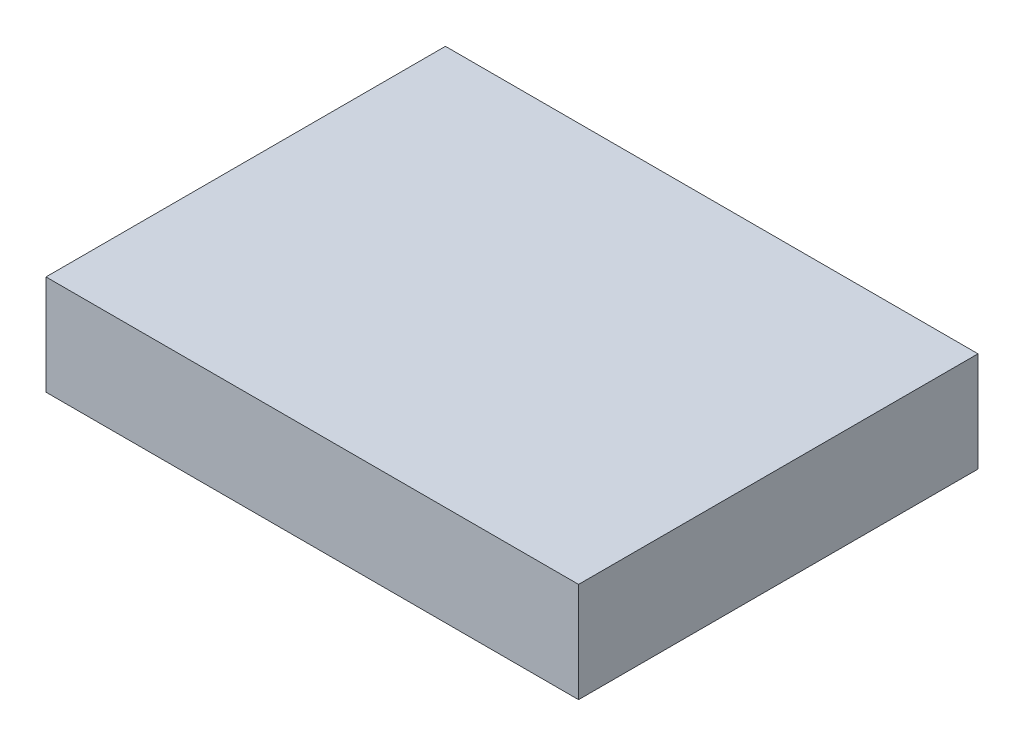
ISO-10303-21;
HEADER;
FILE_DESCRIPTION(('STEP AP214'),'2;1');
FILE_NAME('part.step','',(''),(''),'','','');
FILE_SCHEMA(('AUTOMOTIVE_DESIGN { 1 0 10303 214 1 1 1 1 }'));
ENDSEC;
DATA;
#1=APPLICATION_CONTEXT('core data for automotive mechanical design processes');
#2=APPLICATION_PROTOCOL_DEFINITION('international standard','automotive_design',2000,#1);
#3=PRODUCT_CONTEXT('',#1,'mechanical');
#4=PRODUCT('Part','Part','',(#3));
#5=PRODUCT_RELATED_PRODUCT_CATEGORY('part','',(#4));
#6=PRODUCT_DEFINITION_FORMATION('','',#4);
#7=PRODUCT_DEFINITION_CONTEXT('part definition',#1,'design');
#8=PRODUCT_DEFINITION('design','',#6,#7);
#9=PRODUCT_DEFINITION_SHAPE('','',#8);
#10=(LENGTH_UNIT() NAMED_UNIT(*) SI_UNIT(.MILLI.,.METRE.));
#11=(NAMED_UNIT(*) PLANE_ANGLE_UNIT() SI_UNIT($,.RADIAN.));
#12=(NAMED_UNIT(*) SI_UNIT($,.STERADIAN.) SOLID_ANGLE_UNIT());
#13=UNCERTAINTY_MEASURE_WITH_UNIT(LENGTH_MEASURE(1.E-05),#10,'distance_accuracy_value','');
#14=(GEOMETRIC_REPRESENTATION_CONTEXT(3) GLOBAL_UNCERTAINTY_ASSIGNED_CONTEXT((#13)) GLOBAL_UNIT_ASSIGNED_CONTEXT((#10,
#11,#12)) REPRESENTATION_CONTEXT('',''));
#15=CARTESIAN_POINT('',(0.,0.,0.));
#16=DIRECTION('',(0.,0.,1.));
#17=DIRECTION('',(1.,0.,0.));
#18=AXIS2_PLACEMENT_3D('',#15,#16,#17);
#19=CARTESIAN_POINT('',(0.,-19.05,0.));
#20=DIRECTION('',(-1.,0.,0.));
#21=DIRECTION('',(0.,0.,1.));
#22=AXIS2_PLACEMENT_3D('',#19,#20,#21);
#23=PLANE('',#22);
#24=DIRECTION('',(0.,0.,1.));
#25=VECTOR('',#24,1.);
#26=CARTESIAN_POINT('',(0.,0.,0.));
#27=LINE('',#26,#25);
#28=CARTESIAN_POINT('',(0.,0.,-76.2));
#29=VERTEX_POINT('',#28);
#30=CARTESIAN_POINT('',(0.,0.,0.));
#31=VERTEX_POINT('',#30);
#32=EDGE_CURVE('E95',#29,#31,#27,.T.);
#33=ORIENTED_EDGE('',*,*,#32,.F.);
#34=DIRECTION('',(0.,1.,0.));
#35=VECTOR('',#34,1.);
#36=CARTESIAN_POINT('',(0.,-19.05,-76.2));
#37=LINE('',#36,#35);
#38=CARTESIAN_POINT('',(0.,-19.05,-76.2));
#39=VERTEX_POINT('',#38);
#40=EDGE_CURVE('E11',#39,#29,#37,.T.);
#41=ORIENTED_EDGE('',*,*,#40,.F.);
#42=DIRECTION('',(0.,0.,1.));
#43=VECTOR('',#42,1.);
#44=CARTESIAN_POINT('',(0.,-19.05,0.));
#45=LINE('',#44,#43);
#46=CARTESIAN_POINT('',(0.,-19.05,0.));
#47=VERTEX_POINT('',#46);
#48=EDGE_CURVE('E89',#39,#47,#45,.T.);
#49=ORIENTED_EDGE('',*,*,#48,.T.);
#50=DIRECTION('',(0.,1.,0.));
#51=VECTOR('',#50,1.);
#52=CARTESIAN_POINT('',(0.,-19.05,0.));
#53=LINE('',#52,#51);
#54=EDGE_CURVE('E34',#47,#31,#53,.T.);
#55=ORIENTED_EDGE('',*,*,#54,.T.);
#56=EDGE_LOOP('',(#33,#41,#49,#55));
#57=FACE_BOUND('',#56,.T.);
#58=ADVANCED_FACE('F31',(#57),#23,.T.);
#59=CARTESIAN_POINT('',(0.,-19.05,-76.2));
#60=DIRECTION('',(0.,0.,-1.));
#61=DIRECTION('',(-1.,0.,0.));
#62=AXIS2_PLACEMENT_3D('',#59,#60,#61);
#63=PLANE('',#62);
#64=DIRECTION('',(-1.,0.,0.));
#65=VECTOR('',#64,1.);
#66=CARTESIAN_POINT('',(0.,0.,-76.2));
#67=LINE('',#66,#65);
#68=CARTESIAN_POINT('',(101.6,0.,-76.2));
#69=VERTEX_POINT('',#68);
#70=EDGE_CURVE('E91',#69,#29,#67,.T.);
#71=ORIENTED_EDGE('',*,*,#70,.F.);
#72=DIRECTION('',(0.,1.,0.));
#73=VECTOR('',#72,1.);
#74=CARTESIAN_POINT('',(101.6,-19.05,-76.2));
#75=LINE('',#74,#73);
#76=CARTESIAN_POINT('',(101.6,-19.05,-76.2));
#77=VERTEX_POINT('',#76);
#78=EDGE_CURVE('E40',#77,#69,#75,.T.);
#79=ORIENTED_EDGE('',*,*,#78,.F.);
#80=DIRECTION('',(-1.,0.,0.));
#81=VECTOR('',#80,1.);
#82=CARTESIAN_POINT('',(0.,-19.05,-76.2));
#83=LINE('',#82,#81);
#84=EDGE_CURVE('E86',#77,#39,#83,.T.);
#85=ORIENTED_EDGE('',*,*,#84,.T.);
#86=ORIENTED_EDGE('',*,*,#40,.T.);
#87=EDGE_LOOP('',(#71,#79,#85,#86));
#88=FACE_BOUND('',#87,.T.);
#89=ADVANCED_FACE('F105',(#88),#63,.T.);
#90=CARTESIAN_POINT('',(101.6,-19.05,0.));
#91=DIRECTION('',(1.,0.,0.));
#92=DIRECTION('',(0.,0.,-1.));
#93=AXIS2_PLACEMENT_3D('',#90,#91,#92);
#94=PLANE('',#93);
#95=DIRECTION('',(0.,0.,-1.));
#96=VECTOR('',#95,1.);
#97=CARTESIAN_POINT('',(101.6,0.,0.));
#98=LINE('',#97,#96);
#99=CARTESIAN_POINT('',(101.6,0.,0.));
#100=VERTEX_POINT('',#99);
#101=EDGE_CURVE('E81',#100,#69,#98,.T.);
#102=ORIENTED_EDGE('',*,*,#101,.F.);
#103=DIRECTION('',(0.,1.,0.));
#104=VECTOR('',#103,1.);
#105=CARTESIAN_POINT('',(101.6,-19.05,0.));
#106=LINE('',#105,#104);
#107=CARTESIAN_POINT('',(101.6,-19.05,0.));
#108=VERTEX_POINT('',#107);
#109=EDGE_CURVE('E76',#108,#100,#106,.T.);
#110=ORIENTED_EDGE('',*,*,#109,.F.);
#111=DIRECTION('',(0.,0.,-1.));
#112=VECTOR('',#111,1.);
#113=CARTESIAN_POINT('',(101.6,-19.05,0.));
#114=LINE('',#113,#112);
#115=EDGE_CURVE('E79',#108,#77,#114,.T.);
#116=ORIENTED_EDGE('',*,*,#115,.T.);
#117=ORIENTED_EDGE('',*,*,#78,.T.);
#118=EDGE_LOOP('',(#102,#110,#116,#117));
#119=FACE_BOUND('',#118,.T.);
#120=ADVANCED_FACE('F78',(#119),#94,.T.);
#121=CARTESIAN_POINT('',(0.,-19.05,0.));
#122=DIRECTION('',(0.,0.,1.));
#123=DIRECTION('',(1.,0.,0.));
#124=AXIS2_PLACEMENT_3D('',#121,#122,#123);
#125=PLANE('',#124);
#126=DIRECTION('',(1.,0.,0.));
#127=VECTOR('',#126,1.);
#128=CARTESIAN_POINT('',(0.,0.,0.));
#129=LINE('',#128,#127);
#130=EDGE_CURVE('E98',#31,#100,#129,.T.);
#131=ORIENTED_EDGE('',*,*,#130,.F.);
#132=ORIENTED_EDGE('',*,*,#54,.F.);
#133=DIRECTION('',(1.,0.,0.));
#134=VECTOR('',#133,1.);
#135=CARTESIAN_POINT('',(0.,-19.05,0.));
#136=LINE('',#135,#134);
#137=EDGE_CURVE('E85',#47,#108,#136,.T.);
#138=ORIENTED_EDGE('',*,*,#137,.T.);
#139=ORIENTED_EDGE('',*,*,#109,.T.);
#140=EDGE_LOOP('',(#131,#132,#138,#139));
#141=FACE_BOUND('',#140,.T.);
#142=ADVANCED_FACE('F88',(#141),#125,.T.);
#143=CARTESIAN_POINT('',(0.,-19.05,-76.2));
#144=DIRECTION('',(0.,-1.,0.));
#145=DIRECTION('',(0.,0.,-1.));
#146=AXIS2_PLACEMENT_3D('',#143,#144,#145);
#147=PLANE('',#146);
#148=ORIENTED_EDGE('',*,*,#48,.F.);
#149=ORIENTED_EDGE('',*,*,#84,.F.);
#150=ORIENTED_EDGE('',*,*,#115,.F.);
#151=ORIENTED_EDGE('',*,*,#137,.F.);
#152=EDGE_LOOP('',(#148,#149,#150,#151));
#153=FACE_BOUND('',#152,.T.);
#154=ADVANCED_FACE('F84',(#153),#147,.T.);
#155=CARTESIAN_POINT('',(0.,0.,-76.2));
#156=DIRECTION('',(0.,-1.,0.));
#157=DIRECTION('',(0.,0.,-1.));
#158=AXIS2_PLACEMENT_3D('',#155,#156,#157);
#159=PLANE('',#158);
#160=ORIENTED_EDGE('',*,*,#32,.T.);
#161=ORIENTED_EDGE('',*,*,#130,.T.);
#162=ORIENTED_EDGE('',*,*,#101,.T.);
#163=ORIENTED_EDGE('',*,*,#70,.T.);
#164=EDGE_LOOP('',(#160,#161,#162,#163));
#165=FACE_BOUND('',#164,.T.);
#166=ADVANCED_FACE('F104',(#165),#159,.F.);
#167=CLOSED_SHELL('',(#58,#89,#120,#142,#154,#166));
#168=MANIFOLD_SOLID_BREP('B2',#167);
#169=ADVANCED_BREP_SHAPE_REPRESENTATION('',(#18,#168),#14);
#170=SHAPE_DEFINITION_REPRESENTATION(#9,#169);
ENDSEC;
END-ISO-10303-21;
